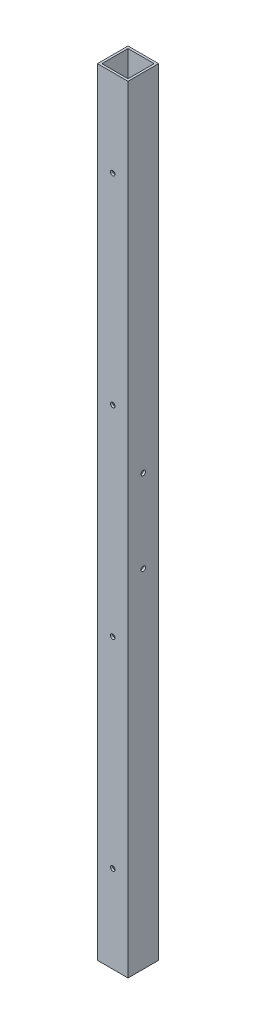
ISO-10303-21;
HEADER;
FILE_DESCRIPTION(('STEP AP214'),'2;1');
FILE_NAME('part.step','',(''),(''),'','','');
FILE_SCHEMA(('AUTOMOTIVE_DESIGN { 1 0 10303 214 1 1 1 1 }'));
ENDSEC;
DATA;
#1=APPLICATION_CONTEXT('core data for automotive mechanical design processes');
#2=APPLICATION_PROTOCOL_DEFINITION('international standard','automotive_design',2000,#1);
#3=PRODUCT_CONTEXT('',#1,'mechanical');
#4=PRODUCT('Part','Part','',(#3));
#5=PRODUCT_RELATED_PRODUCT_CATEGORY('part','',(#4));
#6=PRODUCT_DEFINITION_FORMATION('','',#4);
#7=PRODUCT_DEFINITION_CONTEXT('part definition',#1,'design');
#8=PRODUCT_DEFINITION('design','',#6,#7);
#9=PRODUCT_DEFINITION_SHAPE('','',#8);
#10=(LENGTH_UNIT() NAMED_UNIT(*) SI_UNIT(.MILLI.,.METRE.));
#11=(NAMED_UNIT(*) PLANE_ANGLE_UNIT() SI_UNIT($,.RADIAN.));
#12=(NAMED_UNIT(*) SI_UNIT($,.STERADIAN.) SOLID_ANGLE_UNIT());
#13=UNCERTAINTY_MEASURE_WITH_UNIT(LENGTH_MEASURE(1.E-05),#10,'distance_accuracy_value','');
#14=(GEOMETRIC_REPRESENTATION_CONTEXT(3) GLOBAL_UNCERTAINTY_ASSIGNED_CONTEXT((#13)) GLOBAL_UNIT_ASSIGNED_CONTEXT((#10,
#11,#12)) REPRESENTATION_CONTEXT('',''));
#15=CARTESIAN_POINT('',(0.,0.,0.));
#16=DIRECTION('',(0.,0.,1.));
#17=DIRECTION('',(1.,0.,0.));
#18=AXIS2_PLACEMENT_3D('',#15,#16,#17);
#19=CARTESIAN_POINT('',(-22.225,1130.3,22.225));
#20=DIRECTION('',(0.,0.,-1.));
#21=DIRECTION('',(-1.,0.,0.));
#22=AXIS2_PLACEMENT_3D('',#19,#20,#21);
#23=PLANE('',#22);
#24=CARTESIAN_POINT('',(0.,1003.3,22.225));
#25=DIRECTION('',(0.,0.,1.));
#26=DIRECTION('',(1.,0.,0.));
#27=AXIS2_PLACEMENT_3D('',#24,#25,#26);
#28=CIRCLE('',#27,3.37819999999999);
#29=CARTESIAN_POINT('',(3.3782,1003.3,22.225));
#30=VERTEX_POINT('',#29);
#31=EDGE_CURVE('E189',#30,#30,#28,.T.);
#32=ORIENTED_EDGE('',*,*,#31,.F.);
#33=EDGE_LOOP('',(#32));
#34=FACE_BOUND('',#33,.T.);
#35=CARTESIAN_POINT('',(0.,711.2,22.225));
#36=DIRECTION('',(0.,0.,1.));
#37=DIRECTION('',(1.,0.,0.));
#38=AXIS2_PLACEMENT_3D('',#35,#36,#37);
#39=CIRCLE('',#38,3.37819999999999);
#40=CARTESIAN_POINT('',(3.37820000000004,711.2,22.225));
#41=VERTEX_POINT('',#40);
#42=EDGE_CURVE('E186',#41,#41,#39,.T.);
#43=ORIENTED_EDGE('',*,*,#42,.F.);
#44=EDGE_LOOP('',(#43));
#45=FACE_BOUND('',#44,.T.);
#46=CARTESIAN_POINT('',(0.,419.1,22.225));
#47=DIRECTION('',(0.,0.,1.));
#48=DIRECTION('',(1.,0.,0.));
#49=AXIS2_PLACEMENT_3D('',#46,#47,#48);
#50=CIRCLE('',#49,3.37819999999999);
#51=CARTESIAN_POINT('',(3.37820000000007,419.1,22.225));
#52=VERTEX_POINT('',#51);
#53=EDGE_CURVE('E204',#52,#52,#50,.T.);
#54=ORIENTED_EDGE('',*,*,#53,.F.);
#55=EDGE_LOOP('',(#54));
#56=FACE_BOUND('',#55,.T.);
#57=DIRECTION('',(1.,0.,0.));
#58=VECTOR('',#57,1.);
#59=CARTESIAN_POINT('',(-22.225,0.,22.225));
#60=LINE('',#59,#58);
#61=CARTESIAN_POINT('',(-22.225,0.,22.225));
#62=VERTEX_POINT('',#61);
#63=CARTESIAN_POINT('',(22.225,0.,22.225));
#64=VERTEX_POINT('',#63);
#65=EDGE_CURVE('E145',#62,#64,#60,.T.);
#66=ORIENTED_EDGE('',*,*,#65,.T.);
#67=DIRECTION('',(0.,-1.,0.));
#68=VECTOR('',#67,1.);
#69=CARTESIAN_POINT('',(22.225,1130.3,22.225));
#70=LINE('',#69,#68);
#71=CARTESIAN_POINT('',(22.225,1130.3,22.225));
#72=VERTEX_POINT('',#71);
#73=EDGE_CURVE('E151',#72,#64,#70,.T.);
#74=ORIENTED_EDGE('',*,*,#73,.F.);
#75=DIRECTION('',(1.,0.,0.));
#76=VECTOR('',#75,1.);
#77=CARTESIAN_POINT('',(-22.225,1130.3,22.225));
#78=LINE('',#77,#76);
#79=CARTESIAN_POINT('',(-22.225,1130.3,22.225));
#80=VERTEX_POINT('',#79);
#81=EDGE_CURVE('E149',#80,#72,#78,.T.);
#82=ORIENTED_EDGE('',*,*,#81,.F.);
#83=DIRECTION('',(0.,-1.,0.));
#84=VECTOR('',#83,1.);
#85=CARTESIAN_POINT('',(-22.225,1130.3,22.225));
#86=LINE('',#85,#84);
#87=EDGE_CURVE('E161',#80,#62,#86,.T.);
#88=ORIENTED_EDGE('',*,*,#87,.T.);
#89=EDGE_LOOP('',(#66,#74,#82,#88));
#90=FACE_BOUND('',#89,.T.);
#91=CARTESIAN_POINT('',(1.22868813358454E-13,127.,22.225));
#92=DIRECTION('',(0.,0.,1.));
#93=DIRECTION('',(1.,0.,0.));
#94=AXIS2_PLACEMENT_3D('',#91,#92,#93);
#95=CIRCLE('',#94,3.37819999999999);
#96=CARTESIAN_POINT('',(3.37820000000011,127.,22.225));
#97=VERTEX_POINT('',#96);
#98=EDGE_CURVE('E211',#97,#97,#95,.T.);
#99=ORIENTED_EDGE('',*,*,#98,.F.);
#100=EDGE_LOOP('',(#99));
#101=FACE_BOUND('',#100,.T.);
#102=ADVANCED_FACE('F35',(#34,#45,#56,#90,#101),#23,.F.);
#103=CARTESIAN_POINT('',(0.,1130.3,0.));
#104=DIRECTION('',(0.,-1.,0.));
#105=DIRECTION('',(0.,0.,-1.));
#106=AXIS2_PLACEMENT_3D('',#103,#104,#105);
#107=PLANE('',#106);
#108=DIRECTION('',(0.,0.,-1.));
#109=VECTOR('',#108,1.);
#110=CARTESIAN_POINT('',(22.225,1130.3,22.225));
#111=LINE('',#110,#109);
#112=CARTESIAN_POINT('',(22.225,1130.3,-22.225));
#113=VERTEX_POINT('',#112);
#114=EDGE_CURVE('E141',#72,#113,#111,.T.);
#115=ORIENTED_EDGE('',*,*,#114,.T.);
#116=DIRECTION('',(-1.,0.,0.));
#117=VECTOR('',#116,1.);
#118=CARTESIAN_POINT('',(-22.225,1130.3,-22.225));
#119=LINE('',#118,#117);
#120=CARTESIAN_POINT('',(-22.225,1130.3,-22.225));
#121=VERTEX_POINT('',#120);
#122=EDGE_CURVE('E144',#113,#121,#119,.T.);
#123=ORIENTED_EDGE('',*,*,#122,.T.);
#124=DIRECTION('',(0.,0.,1.));
#125=VECTOR('',#124,1.);
#126=CARTESIAN_POINT('',(-22.225,1130.3,22.225));
#127=LINE('',#126,#125);
#128=EDGE_CURVE('E147',#121,#80,#127,.T.);
#129=ORIENTED_EDGE('',*,*,#128,.T.);
#130=ORIENTED_EDGE('',*,*,#81,.T.);
#131=EDGE_LOOP('',(#115,#123,#129,#130));
#132=FACE_BOUND('',#131,.T.);
#133=DIRECTION('',(0.,0.,1.));
#134=VECTOR('',#133,1.);
#135=CARTESIAN_POINT('',(-19.05,1130.3,19.05));
#136=LINE('',#135,#134);
#137=CARTESIAN_POINT('',(-19.05,1130.3,-19.05));
#138=VERTEX_POINT('',#137);
#139=CARTESIAN_POINT('',(-19.05,1130.3,19.05));
#140=VERTEX_POINT('',#139);
#141=EDGE_CURVE('E102',#138,#140,#136,.T.);
#142=ORIENTED_EDGE('',*,*,#141,.F.);
#143=DIRECTION('',(-1.,0.,0.));
#144=VECTOR('',#143,1.);
#145=CARTESIAN_POINT('',(-19.05,1130.3,-19.05));
#146=LINE('',#145,#144);
#147=CARTESIAN_POINT('',(19.05,1130.3,-19.05));
#148=VERTEX_POINT('',#147);
#149=EDGE_CURVE('E125',#148,#138,#146,.T.);
#150=ORIENTED_EDGE('',*,*,#149,.F.);
#151=DIRECTION('',(0.,0.,-1.));
#152=VECTOR('',#151,1.);
#153=CARTESIAN_POINT('',(19.05,1130.3,19.05));
#154=LINE('',#153,#152);
#155=CARTESIAN_POINT('',(19.05,1130.3,19.05));
#156=VERTEX_POINT('',#155);
#157=EDGE_CURVE('E123',#156,#148,#154,.T.);
#158=ORIENTED_EDGE('',*,*,#157,.F.);
#159=DIRECTION('',(1.,0.,0.));
#160=VECTOR('',#159,1.);
#161=CARTESIAN_POINT('',(-19.05,1130.3,19.05));
#162=LINE('',#161,#160);
#163=EDGE_CURVE('E110',#140,#156,#162,.T.);
#164=ORIENTED_EDGE('',*,*,#163,.F.);
#165=EDGE_LOOP('',(#142,#150,#158,#164));
#166=FACE_BOUND('',#165,.T.);
#167=ADVANCED_FACE('F122',(#132,#166),#107,.F.);
#168=CARTESIAN_POINT('',(0.,0.,0.));
#169=DIRECTION('',(0.,-1.,0.));
#170=DIRECTION('',(0.,0.,-1.));
#171=AXIS2_PLACEMENT_3D('',#168,#169,#170);
#172=PLANE('',#171);
#173=DIRECTION('',(0.,0.,-1.));
#174=VECTOR('',#173,1.);
#175=CARTESIAN_POINT('',(22.225,0.,22.225));
#176=LINE('',#175,#174);
#177=CARTESIAN_POINT('',(22.225,0.,-22.225));
#178=VERTEX_POINT('',#177);
#179=EDGE_CURVE('E118',#64,#178,#176,.T.);
#180=ORIENTED_EDGE('',*,*,#179,.F.);
#181=ORIENTED_EDGE('',*,*,#65,.F.);
#182=DIRECTION('',(0.,0.,1.));
#183=VECTOR('',#182,1.);
#184=CARTESIAN_POINT('',(-22.225,0.,22.225));
#185=LINE('',#184,#183);
#186=CARTESIAN_POINT('',(-22.225,0.,-22.225));
#187=VERTEX_POINT('',#186);
#188=EDGE_CURVE('E156',#187,#62,#185,.T.);
#189=ORIENTED_EDGE('',*,*,#188,.F.);
#190=DIRECTION('',(-1.,0.,0.));
#191=VECTOR('',#190,1.);
#192=CARTESIAN_POINT('',(-22.225,0.,-22.225));
#193=LINE('',#192,#191);
#194=EDGE_CURVE('E154',#178,#187,#193,.T.);
#195=ORIENTED_EDGE('',*,*,#194,.F.);
#196=EDGE_LOOP('',(#180,#181,#189,#195));
#197=FACE_BOUND('',#196,.T.);
#198=DIRECTION('',(-1.,0.,0.));
#199=VECTOR('',#198,1.);
#200=CARTESIAN_POINT('',(-19.05,0.,-19.05));
#201=LINE('',#200,#199);
#202=CARTESIAN_POINT('',(19.05,0.,-19.05));
#203=VERTEX_POINT('',#202);
#204=CARTESIAN_POINT('',(-19.05,0.,-19.05));
#205=VERTEX_POINT('',#204);
#206=EDGE_CURVE('E111',#203,#205,#201,.T.);
#207=ORIENTED_EDGE('',*,*,#206,.T.);
#208=DIRECTION('',(0.,0.,1.));
#209=VECTOR('',#208,1.);
#210=CARTESIAN_POINT('',(-19.05,0.,19.05));
#211=LINE('',#210,#209);
#212=CARTESIAN_POINT('',(-19.05,0.,19.05));
#213=VERTEX_POINT('',#212);
#214=EDGE_CURVE('E60',#205,#213,#211,.T.);
#215=ORIENTED_EDGE('',*,*,#214,.T.);
#216=DIRECTION('',(1.,0.,0.));
#217=VECTOR('',#216,1.);
#218=CARTESIAN_POINT('',(-19.05,0.,19.05));
#219=LINE('',#218,#217);
#220=CARTESIAN_POINT('',(19.05,0.,19.05));
#221=VERTEX_POINT('',#220);
#222=EDGE_CURVE('E117',#213,#221,#219,.T.);
#223=ORIENTED_EDGE('',*,*,#222,.T.);
#224=DIRECTION('',(0.,0.,-1.));
#225=VECTOR('',#224,1.);
#226=CARTESIAN_POINT('',(19.05,0.,19.05));
#227=LINE('',#226,#225);
#228=EDGE_CURVE('E133',#221,#203,#227,.T.);
#229=ORIENTED_EDGE('',*,*,#228,.T.);
#230=EDGE_LOOP('',(#207,#215,#223,#229));
#231=FACE_BOUND('',#230,.T.);
#232=ADVANCED_FACE('F243',(#197,#231),#172,.T.);
#233=CARTESIAN_POINT('',(22.225,1130.3,22.225));
#234=DIRECTION('',(-1.,0.,0.));
#235=DIRECTION('',(0.,0.,1.));
#236=AXIS2_PLACEMENT_3D('',#233,#234,#235);
#237=PLANE('',#236);
#238=CARTESIAN_POINT('',(22.225,625.475,0.));
#239=DIRECTION('',(1.,0.,0.));
#240=DIRECTION('',(0.,0.,-1.));
#241=AXIS2_PLACEMENT_3D('',#238,#239,#240);
#242=CIRCLE('',#241,3.3782);
#243=CARTESIAN_POINT('',(22.225,625.475,-3.37819999999998));
#244=VERTEX_POINT('',#243);
#245=EDGE_CURVE('E471',#244,#244,#242,.T.);
#246=ORIENTED_EDGE('',*,*,#245,.F.);
#247=EDGE_LOOP('',(#246));
#248=FACE_BOUND('',#247,.T.);
#249=CARTESIAN_POINT('',(22.225,504.825,0.));
#250=DIRECTION('',(1.,0.,0.));
#251=DIRECTION('',(0.,0.,-1.));
#252=AXIS2_PLACEMENT_3D('',#249,#250,#251);
#253=CIRCLE('',#252,3.3782);
#254=CARTESIAN_POINT('',(22.225,504.825,-3.3782));
#255=VERTEX_POINT('',#254);
#256=EDGE_CURVE('E481',#255,#255,#253,.T.);
#257=ORIENTED_EDGE('',*,*,#256,.F.);
#258=EDGE_LOOP('',(#257));
#259=FACE_BOUND('',#258,.T.);
#260=ORIENTED_EDGE('',*,*,#179,.T.);
#261=DIRECTION('',(0.,-1.,0.));
#262=VECTOR('',#261,1.);
#263=CARTESIAN_POINT('',(22.225,1130.3,-22.225));
#264=LINE('',#263,#262);
#265=EDGE_CURVE('E11',#113,#178,#264,.T.);
#266=ORIENTED_EDGE('',*,*,#265,.F.);
#267=ORIENTED_EDGE('',*,*,#114,.F.);
#268=ORIENTED_EDGE('',*,*,#73,.T.);
#269=EDGE_LOOP('',(#260,#266,#267,#268));
#270=FACE_BOUND('',#269,.T.);
#271=ADVANCED_FACE('F37',(#248,#259,#270),#237,.F.);
#272=CARTESIAN_POINT('',(-22.225,1130.3,-22.225));
#273=DIRECTION('',(0.,0.,1.));
#274=DIRECTION('',(1.,0.,0.));
#275=AXIS2_PLACEMENT_3D('',#272,#273,#274);
#276=PLANE('',#275);
#277=CARTESIAN_POINT('',(0.,1003.3,-22.225));
#278=DIRECTION('',(0.,0.,1.));
#279=DIRECTION('',(1.,0.,0.));
#280=AXIS2_PLACEMENT_3D('',#277,#278,#279);
#281=CIRCLE('',#280,3.37819999999999);
#282=CARTESIAN_POINT('',(3.37820000000001,1003.3,-22.225));
#283=VERTEX_POINT('',#282);
#284=EDGE_CURVE('E182',#283,#283,#281,.T.);
#285=ORIENTED_EDGE('',*,*,#284,.T.);
#286=EDGE_LOOP('',(#285));
#287=FACE_BOUND('',#286,.T.);
#288=CARTESIAN_POINT('',(0.,711.2,-22.225));
#289=DIRECTION('',(0.,0.,1.));
#290=DIRECTION('',(1.,0.,0.));
#291=AXIS2_PLACEMENT_3D('',#288,#289,#290);
#292=CIRCLE('',#291,3.37819999999999);
#293=CARTESIAN_POINT('',(3.37820000000004,711.2,-22.225));
#294=VERTEX_POINT('',#293);
#295=EDGE_CURVE('E178',#294,#294,#292,.T.);
#296=ORIENTED_EDGE('',*,*,#295,.T.);
#297=EDGE_LOOP('',(#296));
#298=FACE_BOUND('',#297,.T.);
#299=CARTESIAN_POINT('',(0.,419.1,-22.225));
#300=DIRECTION('',(0.,0.,1.));
#301=DIRECTION('',(1.,0.,0.));
#302=AXIS2_PLACEMENT_3D('',#299,#300,#301);
#303=CIRCLE('',#302,3.37819999999999);
#304=CARTESIAN_POINT('',(3.37820000000008,419.1,-22.225));
#305=VERTEX_POINT('',#304);
#306=EDGE_CURVE('E174',#305,#305,#303,.T.);
#307=ORIENTED_EDGE('',*,*,#306,.T.);
#308=EDGE_LOOP('',(#307));
#309=FACE_BOUND('',#308,.T.);
#310=CARTESIAN_POINT('',(1.22868813358454E-13,127.,-22.225));
#311=DIRECTION('',(0.,0.,1.));
#312=DIRECTION('',(1.,0.,0.));
#313=AXIS2_PLACEMENT_3D('',#310,#311,#312);
#314=CIRCLE('',#313,3.37819999999999);
#315=CARTESIAN_POINT('',(3.37820000000012,127.,-22.225));
#316=VERTEX_POINT('',#315);
#317=EDGE_CURVE('E169',#316,#316,#314,.T.);
#318=ORIENTED_EDGE('',*,*,#317,.T.);
#319=EDGE_LOOP('',(#318));
#320=FACE_BOUND('',#319,.T.);
#321=ORIENTED_EDGE('',*,*,#194,.T.);
#322=DIRECTION('',(0.,-1.,0.));
#323=VECTOR('',#322,1.);
#324=CARTESIAN_POINT('',(-22.225,1130.3,-22.225));
#325=LINE('',#324,#323);
#326=EDGE_CURVE('E44',#121,#187,#325,.T.);
#327=ORIENTED_EDGE('',*,*,#326,.F.);
#328=ORIENTED_EDGE('',*,*,#122,.F.);
#329=ORIENTED_EDGE('',*,*,#265,.T.);
#330=EDGE_LOOP('',(#321,#327,#328,#329));
#331=FACE_BOUND('',#330,.T.);
#332=ADVANCED_FACE('F251',(#287,#298,#309,#320,#331),#276,.F.);
#333=CARTESIAN_POINT('',(-22.225,1130.3,22.225));
#334=DIRECTION('',(1.,0.,0.));
#335=DIRECTION('',(0.,0.,-1.));
#336=AXIS2_PLACEMENT_3D('',#333,#334,#335);
#337=PLANE('',#336);
#338=CARTESIAN_POINT('',(-22.225,625.475,0.));
#339=DIRECTION('',(1.,0.,0.));
#340=DIRECTION('',(0.,0.,-1.));
#341=AXIS2_PLACEMENT_3D('',#338,#339,#340);
#342=CIRCLE('',#341,3.3782);
#343=CARTESIAN_POINT('',(-22.225,625.475,-3.37819999999998));
#344=VERTEX_POINT('',#343);
#345=EDGE_CURVE('E472',#344,#344,#342,.T.);
#346=ORIENTED_EDGE('',*,*,#345,.T.);
#347=EDGE_LOOP('',(#346));
#348=FACE_BOUND('',#347,.T.);
#349=CARTESIAN_POINT('',(-22.225,504.825,0.));
#350=DIRECTION('',(1.,0.,0.));
#351=DIRECTION('',(0.,0.,-1.));
#352=AXIS2_PLACEMENT_3D('',#349,#350,#351);
#353=CIRCLE('',#352,3.3782);
#354=CARTESIAN_POINT('',(-22.225,504.825,-3.3782));
#355=VERTEX_POINT('',#354);
#356=EDGE_CURVE('E484',#355,#355,#353,.T.);
#357=ORIENTED_EDGE('',*,*,#356,.T.);
#358=EDGE_LOOP('',(#357));
#359=FACE_BOUND('',#358,.T.);
#360=ORIENTED_EDGE('',*,*,#188,.T.);
#361=ORIENTED_EDGE('',*,*,#87,.F.);
#362=ORIENTED_EDGE('',*,*,#128,.F.);
#363=ORIENTED_EDGE('',*,*,#326,.T.);
#364=EDGE_LOOP('',(#360,#361,#362,#363));
#365=FACE_BOUND('',#364,.T.);
#366=ADVANCED_FACE('F232',(#348,#359,#365),#337,.F.);
#367=CARTESIAN_POINT('',(-19.05,1130.3,19.05));
#368=DIRECTION('',(1.,0.,0.));
#369=DIRECTION('',(0.,0.,-1.));
#370=AXIS2_PLACEMENT_3D('',#367,#368,#369);
#371=PLANE('',#370);
#372=CARTESIAN_POINT('',(-19.05,625.475,0.));
#373=DIRECTION('',(1.,0.,0.));
#374=DIRECTION('',(0.,0.,-1.));
#375=AXIS2_PLACEMENT_3D('',#372,#373,#374);
#376=CIRCLE('',#375,3.3782);
#377=CARTESIAN_POINT('',(-19.05,625.475,-3.37819999999998));
#378=VERTEX_POINT('',#377);
#379=EDGE_CURVE('E478',#378,#378,#376,.T.);
#380=ORIENTED_EDGE('',*,*,#379,.F.);
#381=EDGE_LOOP('',(#380));
#382=FACE_BOUND('',#381,.T.);
#383=CARTESIAN_POINT('',(-19.05,504.825,0.));
#384=DIRECTION('',(1.,0.,0.));
#385=DIRECTION('',(0.,0.,-1.));
#386=AXIS2_PLACEMENT_3D('',#383,#384,#385);
#387=CIRCLE('',#386,3.3782);
#388=CARTESIAN_POINT('',(-19.05,504.825,-3.3782));
#389=VERTEX_POINT('',#388);
#390=EDGE_CURVE('E39',#389,#389,#387,.T.);
#391=ORIENTED_EDGE('',*,*,#390,.F.);
#392=EDGE_LOOP('',(#391));
#393=FACE_BOUND('',#392,.T.);
#394=ORIENTED_EDGE('',*,*,#214,.F.);
#395=DIRECTION('',(0.,-1.,0.));
#396=VECTOR('',#395,1.);
#397=CARTESIAN_POINT('',(-19.05,1130.3,-19.05));
#398=LINE('',#397,#396);
#399=EDGE_CURVE('E106',#138,#205,#398,.T.);
#400=ORIENTED_EDGE('',*,*,#399,.F.);
#401=ORIENTED_EDGE('',*,*,#141,.T.);
#402=DIRECTION('',(0.,-1.,0.));
#403=VECTOR('',#402,1.);
#404=CARTESIAN_POINT('',(-19.05,1130.3,19.05));
#405=LINE('',#404,#403);
#406=EDGE_CURVE('E105',#140,#213,#405,.T.);
#407=ORIENTED_EDGE('',*,*,#406,.T.);
#408=EDGE_LOOP('',(#394,#400,#401,#407));
#409=FACE_BOUND('',#408,.T.);
#410=ADVANCED_FACE('F104',(#382,#393,#409),#371,.T.);
#411=CARTESIAN_POINT('',(-19.05,1130.3,19.05));
#412=DIRECTION('',(0.,0.,-1.));
#413=DIRECTION('',(-1.,0.,0.));
#414=AXIS2_PLACEMENT_3D('',#411,#412,#413);
#415=PLANE('',#414);
#416=CARTESIAN_POINT('',(0.,1003.3,19.05));
#417=DIRECTION('',(0.,0.,-1.));
#418=DIRECTION('',(-1.,0.,0.));
#419=AXIS2_PLACEMENT_3D('',#416,#417,#418);
#420=CIRCLE('',#419,3.37819999999999);
#421=CARTESIAN_POINT('',(-3.37819999999998,1003.3,19.05));
#422=VERTEX_POINT('',#421);
#423=EDGE_CURVE('E181',#422,#422,#420,.T.);
#424=ORIENTED_EDGE('',*,*,#423,.F.);
#425=EDGE_LOOP('',(#424));
#426=FACE_BOUND('',#425,.T.);
#427=CARTESIAN_POINT('',(0.,711.2,19.05));
#428=DIRECTION('',(0.,0.,-1.));
#429=DIRECTION('',(-1.,0.,0.));
#430=AXIS2_PLACEMENT_3D('',#427,#428,#429);
#431=CIRCLE('',#430,3.37819999999999);
#432=CARTESIAN_POINT('',(-3.37819999999994,711.2,19.05));
#433=VERTEX_POINT('',#432);
#434=EDGE_CURVE('E177',#433,#433,#431,.T.);
#435=ORIENTED_EDGE('',*,*,#434,.F.);
#436=EDGE_LOOP('',(#435));
#437=FACE_BOUND('',#436,.T.);
#438=CARTESIAN_POINT('',(0.,419.1,19.05));
#439=DIRECTION('',(0.,0.,-1.));
#440=DIRECTION('',(-1.,0.,0.));
#441=AXIS2_PLACEMENT_3D('',#438,#439,#440);
#442=CIRCLE('',#441,3.37819999999999);
#443=CARTESIAN_POINT('',(-3.3781999999999,419.1,19.05));
#444=VERTEX_POINT('',#443);
#445=EDGE_CURVE('E170',#444,#444,#442,.T.);
#446=ORIENTED_EDGE('',*,*,#445,.F.);
#447=EDGE_LOOP('',(#446));
#448=FACE_BOUND('',#447,.T.);
#449=CARTESIAN_POINT('',(1.22868813358454E-13,127.,19.05));
#450=DIRECTION('',(0.,0.,-1.));
#451=DIRECTION('',(-1.,0.,0.));
#452=AXIS2_PLACEMENT_3D('',#449,#450,#451);
#453=CIRCLE('',#452,3.37819999999999);
#454=CARTESIAN_POINT('',(-3.37819999999987,127.,19.05));
#455=VERTEX_POINT('',#454);
#456=EDGE_CURVE('E131',#455,#455,#453,.T.);
#457=ORIENTED_EDGE('',*,*,#456,.F.);
#458=EDGE_LOOP('',(#457));
#459=FACE_BOUND('',#458,.T.);
#460=ORIENTED_EDGE('',*,*,#222,.F.);
#461=ORIENTED_EDGE('',*,*,#406,.F.);
#462=ORIENTED_EDGE('',*,*,#163,.T.);
#463=DIRECTION('',(0.,-1.,0.));
#464=VECTOR('',#463,1.);
#465=CARTESIAN_POINT('',(19.05,1130.3,19.05));
#466=LINE('',#465,#464);
#467=EDGE_CURVE('E119',#156,#221,#466,.T.);
#468=ORIENTED_EDGE('',*,*,#467,.T.);
#469=EDGE_LOOP('',(#460,#461,#462,#468));
#470=FACE_BOUND('',#469,.T.);
#471=ADVANCED_FACE('F114',(#426,#437,#448,#459,#470),#415,.T.);
#472=CARTESIAN_POINT('',(19.05,1130.3,19.05));
#473=DIRECTION('',(-1.,0.,0.));
#474=DIRECTION('',(0.,0.,1.));
#475=AXIS2_PLACEMENT_3D('',#472,#473,#474);
#476=PLANE('',#475);
#477=CARTESIAN_POINT('',(19.05,625.475,0.));
#478=DIRECTION('',(-1.,0.,0.));
#479=DIRECTION('',(0.,0.,1.));
#480=AXIS2_PLACEMENT_3D('',#477,#478,#479);
#481=CIRCLE('',#480,3.3782);
#482=CARTESIAN_POINT('',(19.05,625.475,3.37820000000001));
#483=VERTEX_POINT('',#482);
#484=EDGE_CURVE('E468',#483,#483,#481,.T.);
#485=ORIENTED_EDGE('',*,*,#484,.F.);
#486=EDGE_LOOP('',(#485));
#487=FACE_BOUND('',#486,.T.);
#488=CARTESIAN_POINT('',(19.05,504.825,0.));
#489=DIRECTION('',(-1.,0.,0.));
#490=DIRECTION('',(0.,0.,1.));
#491=AXIS2_PLACEMENT_3D('',#488,#489,#490);
#492=CIRCLE('',#491,3.3782);
#493=CARTESIAN_POINT('',(19.05,504.825,3.3782));
#494=VERTEX_POINT('',#493);
#495=EDGE_CURVE('E194',#494,#494,#492,.T.);
#496=ORIENTED_EDGE('',*,*,#495,.F.);
#497=EDGE_LOOP('',(#496));
#498=FACE_BOUND('',#497,.T.);
#499=ORIENTED_EDGE('',*,*,#228,.F.);
#500=ORIENTED_EDGE('',*,*,#467,.F.);
#501=ORIENTED_EDGE('',*,*,#157,.T.);
#502=DIRECTION('',(0.,-1.,0.));
#503=VECTOR('',#502,1.);
#504=CARTESIAN_POINT('',(19.05,1130.3,-19.05));
#505=LINE('',#504,#503);
#506=EDGE_CURVE('E52',#148,#203,#505,.T.);
#507=ORIENTED_EDGE('',*,*,#506,.T.);
#508=EDGE_LOOP('',(#499,#500,#501,#507));
#509=FACE_BOUND('',#508,.T.);
#510=ADVANCED_FACE('F222',(#487,#498,#509),#476,.T.);
#511=CARTESIAN_POINT('',(-19.05,1130.3,-19.05));
#512=DIRECTION('',(0.,0.,1.));
#513=DIRECTION('',(1.,0.,0.));
#514=AXIS2_PLACEMENT_3D('',#511,#512,#513);
#515=PLANE('',#514);
#516=CARTESIAN_POINT('',(0.,1003.3,-19.05));
#517=DIRECTION('',(0.,0.,1.));
#518=DIRECTION('',(1.,0.,0.));
#519=AXIS2_PLACEMENT_3D('',#516,#517,#518);
#520=CIRCLE('',#519,3.37819999999999);
#521=CARTESIAN_POINT('',(3.37820000000001,1003.3,-19.05));
#522=VERTEX_POINT('',#521);
#523=EDGE_CURVE('E179',#522,#522,#520,.T.);
#524=ORIENTED_EDGE('',*,*,#523,.F.);
#525=EDGE_LOOP('',(#524));
#526=FACE_BOUND('',#525,.T.);
#527=CARTESIAN_POINT('',(0.,711.2,-19.05));
#528=DIRECTION('',(0.,0.,1.));
#529=DIRECTION('',(1.,0.,0.));
#530=AXIS2_PLACEMENT_3D('',#527,#528,#529);
#531=CIRCLE('',#530,3.37819999999999);
#532=CARTESIAN_POINT('',(3.37820000000004,711.2,-19.05));
#533=VERTEX_POINT('',#532);
#534=EDGE_CURVE('E175',#533,#533,#531,.T.);
#535=ORIENTED_EDGE('',*,*,#534,.F.);
#536=EDGE_LOOP('',(#535));
#537=FACE_BOUND('',#536,.T.);
#538=CARTESIAN_POINT('',(0.,419.1,-19.05));
#539=DIRECTION('',(0.,0.,1.));
#540=DIRECTION('',(1.,0.,0.));
#541=AXIS2_PLACEMENT_3D('',#538,#539,#540);
#542=CIRCLE('',#541,3.37819999999999);
#543=CARTESIAN_POINT('',(3.37820000000008,419.1,-19.05));
#544=VERTEX_POINT('',#543);
#545=EDGE_CURVE('E173',#544,#544,#542,.T.);
#546=ORIENTED_EDGE('',*,*,#545,.F.);
#547=EDGE_LOOP('',(#546));
#548=FACE_BOUND('',#547,.T.);
#549=CARTESIAN_POINT('',(1.22868813358454E-13,127.,-19.05));
#550=DIRECTION('',(0.,0.,1.));
#551=DIRECTION('',(1.,0.,0.));
#552=AXIS2_PLACEMENT_3D('',#549,#550,#551);
#553=CIRCLE('',#552,3.37819999999999);
#554=CARTESIAN_POINT('',(3.37820000000011,127.,-19.05));
#555=VERTEX_POINT('',#554);
#556=EDGE_CURVE('E166',#555,#555,#553,.T.);
#557=ORIENTED_EDGE('',*,*,#556,.F.);
#558=EDGE_LOOP('',(#557));
#559=FACE_BOUND('',#558,.T.);
#560=ORIENTED_EDGE('',*,*,#206,.F.);
#561=ORIENTED_EDGE('',*,*,#506,.F.);
#562=ORIENTED_EDGE('',*,*,#149,.T.);
#563=ORIENTED_EDGE('',*,*,#399,.T.);
#564=EDGE_LOOP('',(#560,#561,#562,#563));
#565=FACE_BOUND('',#564,.T.);
#566=ADVANCED_FACE('F229',(#526,#537,#548,#559,#565),#515,.T.);
#567=CARTESIAN_POINT('',(1.22868813358454E-13,127.,22.225));
#568=DIRECTION('',(0.,0.,1.));
#569=DIRECTION('',(1.,0.,0.));
#570=AXIS2_PLACEMENT_3D('',#567,#568,#569);
#571=CYLINDRICAL_SURFACE('',#570,3.37819999999999);
#572=ORIENTED_EDGE('',*,*,#556,.T.);
#573=EDGE_LOOP('',(#572));
#574=FACE_BOUND('',#573,.T.);
#575=ORIENTED_EDGE('',*,*,#317,.F.);
#576=EDGE_LOOP('',(#575));
#577=FACE_BOUND('',#576,.T.);
#578=ADVANCED_FACE('F284',(#574,#577),#571,.F.);
#579=ORIENTED_EDGE('',*,*,#456,.T.);
#580=EDGE_LOOP('',(#579));
#581=FACE_BOUND('',#580,.T.);
#582=ORIENTED_EDGE('',*,*,#98,.T.);
#583=EDGE_LOOP('',(#582));
#584=FACE_BOUND('',#583,.T.);
#585=ADVANCED_FACE('F218',(#581,#584),#571,.F.);
#586=CARTESIAN_POINT('',(0.,419.1,22.225));
#587=DIRECTION('',(0.,0.,1.));
#588=DIRECTION('',(1.,0.,0.));
#589=AXIS2_PLACEMENT_3D('',#586,#587,#588);
#590=CYLINDRICAL_SURFACE('',#589,3.37819999999999);
#591=ORIENTED_EDGE('',*,*,#445,.T.);
#592=EDGE_LOOP('',(#591));
#593=FACE_BOUND('',#592,.T.);
#594=ORIENTED_EDGE('',*,*,#53,.T.);
#595=EDGE_LOOP('',(#594));
#596=FACE_BOUND('',#595,.T.);
#597=ADVANCED_FACE('F283',(#593,#596),#590,.F.);
#598=ORIENTED_EDGE('',*,*,#545,.T.);
#599=EDGE_LOOP('',(#598));
#600=FACE_BOUND('',#599,.T.);
#601=ORIENTED_EDGE('',*,*,#306,.F.);
#602=EDGE_LOOP('',(#601));
#603=FACE_BOUND('',#602,.T.);
#604=ADVANCED_FACE('F290',(#600,#603),#590,.F.);
#605=CARTESIAN_POINT('',(0.,711.2,22.225));
#606=DIRECTION('',(0.,0.,1.));
#607=DIRECTION('',(1.,0.,0.));
#608=AXIS2_PLACEMENT_3D('',#605,#606,#607);
#609=CYLINDRICAL_SURFACE('',#608,3.37819999999999);
#610=ORIENTED_EDGE('',*,*,#534,.T.);
#611=EDGE_LOOP('',(#610));
#612=FACE_BOUND('',#611,.T.);
#613=ORIENTED_EDGE('',*,*,#295,.F.);
#614=EDGE_LOOP('',(#613));
#615=FACE_BOUND('',#614,.T.);
#616=ADVANCED_FACE('F392',(#612,#615),#609,.F.);
#617=ORIENTED_EDGE('',*,*,#434,.T.);
#618=EDGE_LOOP('',(#617));
#619=FACE_BOUND('',#618,.T.);
#620=ORIENTED_EDGE('',*,*,#42,.T.);
#621=EDGE_LOOP('',(#620));
#622=FACE_BOUND('',#621,.T.);
#623=ADVANCED_FACE('F391',(#619,#622),#609,.F.);
#624=CARTESIAN_POINT('',(0.,1003.3,22.225));
#625=DIRECTION('',(0.,0.,1.));
#626=DIRECTION('',(1.,0.,0.));
#627=AXIS2_PLACEMENT_3D('',#624,#625,#626);
#628=CYLINDRICAL_SURFACE('',#627,3.37819999999999);
#629=ORIENTED_EDGE('',*,*,#523,.T.);
#630=EDGE_LOOP('',(#629));
#631=FACE_BOUND('',#630,.T.);
#632=ORIENTED_EDGE('',*,*,#284,.F.);
#633=EDGE_LOOP('',(#632));
#634=FACE_BOUND('',#633,.T.);
#635=ADVANCED_FACE('F389',(#631,#634),#628,.F.);
#636=ORIENTED_EDGE('',*,*,#423,.T.);
#637=EDGE_LOOP('',(#636));
#638=FACE_BOUND('',#637,.T.);
#639=ORIENTED_EDGE('',*,*,#31,.T.);
#640=EDGE_LOOP('',(#639));
#641=FACE_BOUND('',#640,.T.);
#642=ADVANCED_FACE('F324',(#638,#641),#628,.F.);
#643=CARTESIAN_POINT('',(22.225,504.825,0.));
#644=DIRECTION('',(1.,0.,0.));
#645=DIRECTION('',(0.,0.,-1.));
#646=AXIS2_PLACEMENT_3D('',#643,#644,#645);
#647=CYLINDRICAL_SURFACE('',#646,3.3782);
#648=ORIENTED_EDGE('',*,*,#390,.T.);
#649=EDGE_LOOP('',(#648));
#650=FACE_BOUND('',#649,.T.);
#651=ORIENTED_EDGE('',*,*,#356,.F.);
#652=EDGE_LOOP('',(#651));
#653=FACE_BOUND('',#652,.T.);
#654=ADVANCED_FACE('F349',(#650,#653),#647,.F.);
#655=ORIENTED_EDGE('',*,*,#495,.T.);
#656=EDGE_LOOP('',(#655));
#657=FACE_BOUND('',#656,.T.);
#658=ORIENTED_EDGE('',*,*,#256,.T.);
#659=EDGE_LOOP('',(#658));
#660=FACE_BOUND('',#659,.T.);
#661=ADVANCED_FACE('F354',(#657,#660),#647,.F.);
#662=CARTESIAN_POINT('',(22.225,625.475,0.));
#663=DIRECTION('',(1.,0.,0.));
#664=DIRECTION('',(0.,0.,-1.));
#665=AXIS2_PLACEMENT_3D('',#662,#663,#664);
#666=CYLINDRICAL_SURFACE('',#665,3.3782);
#667=ORIENTED_EDGE('',*,*,#379,.T.);
#668=EDGE_LOOP('',(#667));
#669=FACE_BOUND('',#668,.T.);
#670=ORIENTED_EDGE('',*,*,#345,.F.);
#671=EDGE_LOOP('',(#670));
#672=FACE_BOUND('',#671,.T.);
#673=ADVANCED_FACE('F364',(#669,#672),#666,.F.);
#674=ORIENTED_EDGE('',*,*,#484,.T.);
#675=EDGE_LOOP('',(#674));
#676=FACE_BOUND('',#675,.T.);
#677=ORIENTED_EDGE('',*,*,#245,.T.);
#678=EDGE_LOOP('',(#677));
#679=FACE_BOUND('',#678,.T.);
#680=ADVANCED_FACE('F373',(#676,#679),#666,.F.);
#681=CLOSED_SHELL('',(#102,#167,#232,#271,#332,#366,#410,#471,#510,#566,#578,#585,#597,#604,
#616,#623,#635,#642,#654,#661,#673,#680));
#682=MANIFOLD_SOLID_BREP('B2',#681);
#683=ADVANCED_BREP_SHAPE_REPRESENTATION('',(#18,#682),#14);
#684=SHAPE_DEFINITION_REPRESENTATION(#9,#683);
ENDSEC;
END-ISO-10303-21;
